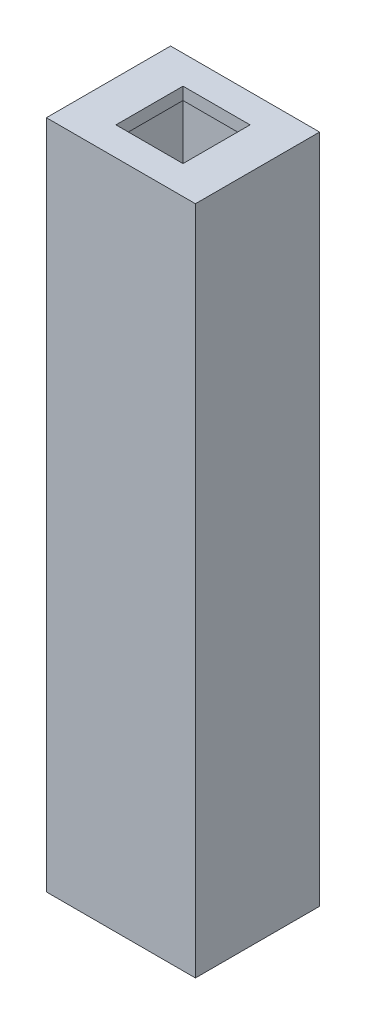
ISO-10303-21;
HEADER;
FILE_DESCRIPTION(('STEP AP214'),'2;1');
FILE_NAME('part.step','',(''),(''),'','','');
FILE_SCHEMA(('AUTOMOTIVE_DESIGN { 1 0 10303 214 1 1 1 1 }'));
ENDSEC;
DATA;
#1=APPLICATION_CONTEXT('core data for automotive mechanical design processes');
#2=APPLICATION_PROTOCOL_DEFINITION('international standard','automotive_design',2000,#1);
#3=PRODUCT_CONTEXT('',#1,'mechanical');
#4=PRODUCT('Part','Part','',(#3));
#5=PRODUCT_RELATED_PRODUCT_CATEGORY('part','',(#4));
#6=PRODUCT_DEFINITION_FORMATION('','',#4);
#7=PRODUCT_DEFINITION_CONTEXT('part definition',#1,'design');
#8=PRODUCT_DEFINITION('design','',#6,#7);
#9=PRODUCT_DEFINITION_SHAPE('','',#8);
#10=(LENGTH_UNIT() NAMED_UNIT(*) SI_UNIT(.MILLI.,.METRE.));
#11=(NAMED_UNIT(*) PLANE_ANGLE_UNIT() SI_UNIT($,.RADIAN.));
#12=(NAMED_UNIT(*) SI_UNIT($,.STERADIAN.) SOLID_ANGLE_UNIT());
#13=UNCERTAINTY_MEASURE_WITH_UNIT(LENGTH_MEASURE(1.E-05),#10,'distance_accuracy_value','');
#14=(GEOMETRIC_REPRESENTATION_CONTEXT(3) GLOBAL_UNCERTAINTY_ASSIGNED_CONTEXT((#13)) GLOBAL_UNIT_ASSIGNED_CONTEXT((#10,
#11,#12)) REPRESENTATION_CONTEXT('',''));
#15=CARTESIAN_POINT('',(0.,0.,0.));
#16=DIRECTION('',(0.,0.,1.));
#17=DIRECTION('',(1.,0.,0.));
#18=AXIS2_PLACEMENT_3D('',#15,#16,#17);
#19=CARTESIAN_POINT('',(0.,54.,-3.1));
#20=DIRECTION('',(0.,0.,-1.));
#21=DIRECTION('',(-1.,0.,0.));
#22=AXIS2_PLACEMENT_3D('',#19,#20,#21);
#23=PLANE('',#22);
#24=DIRECTION('',(1.,0.,0.));
#25=VECTOR('',#24,1.);
#26=CARTESIAN_POINT('',(0.,53.,-3.1));
#27=LINE('',#26,#25);
#28=CARTESIAN_POINT('',(-3.1,53.,-3.1));
#29=VERTEX_POINT('',#28);
#30=CARTESIAN_POINT('',(3.1,53.,-3.1));
#31=VERTEX_POINT('',#30);
#32=EDGE_CURVE('E208',#29,#31,#27,.T.);
#33=ORIENTED_EDGE('',*,*,#32,.F.);
#34=DIRECTION('',(0.,-1.,0.));
#35=VECTOR('',#34,1.);
#36=CARTESIAN_POINT('',(-3.1,54.,-3.1));
#37=LINE('',#36,#35);
#38=CARTESIAN_POINT('',(-3.1,0.,-3.1));
#39=VERTEX_POINT('',#38);
#40=EDGE_CURVE('E118',#29,#39,#37,.T.);
#41=ORIENTED_EDGE('',*,*,#40,.T.);
#42=DIRECTION('',(1.,0.,0.));
#43=VECTOR('',#42,1.);
#44=CARTESIAN_POINT('',(0.,0.,-3.1));
#45=LINE('',#44,#43);
#46=CARTESIAN_POINT('',(3.1,0.,-3.1));
#47=VERTEX_POINT('',#46);
#48=EDGE_CURVE('E232',#39,#47,#45,.T.);
#49=ORIENTED_EDGE('',*,*,#48,.T.);
#50=DIRECTION('',(0.,-1.,0.));
#51=VECTOR('',#50,1.);
#52=CARTESIAN_POINT('',(3.1,54.,-3.1));
#53=LINE('',#52,#51);
#54=EDGE_CURVE('E69',#31,#47,#53,.T.);
#55=ORIENTED_EDGE('',*,*,#54,.F.);
#56=EDGE_LOOP('',(#33,#41,#49,#55));
#57=FACE_BOUND('',#56,.T.);
#58=ADVANCED_FACE('F61',(#57),#23,.F.);
#59=CARTESIAN_POINT('',(3.1,54.,0.));
#60=DIRECTION('',(1.,0.,0.));
#61=DIRECTION('',(0.,0.,-1.));
#62=AXIS2_PLACEMENT_3D('',#59,#60,#61);
#63=PLANE('',#62);
#64=DIRECTION('',(0.,0.,1.));
#65=VECTOR('',#64,1.);
#66=CARTESIAN_POINT('',(3.1,53.,0.));
#67=LINE('',#66,#65);
#68=CARTESIAN_POINT('',(3.1,53.,3.1));
#69=VERTEX_POINT('',#68);
#70=EDGE_CURVE('E206',#31,#69,#67,.T.);
#71=ORIENTED_EDGE('',*,*,#70,.F.);
#72=ORIENTED_EDGE('',*,*,#54,.T.);
#73=DIRECTION('',(0.,0.,1.));
#74=VECTOR('',#73,1.);
#75=CARTESIAN_POINT('',(3.1,0.,0.));
#76=LINE('',#75,#74);
#77=CARTESIAN_POINT('',(3.1,0.,3.1));
#78=VERTEX_POINT('',#77);
#79=EDGE_CURVE('E234',#47,#78,#76,.T.);
#80=ORIENTED_EDGE('',*,*,#79,.T.);
#81=DIRECTION('',(0.,-1.,0.));
#82=VECTOR('',#81,1.);
#83=CARTESIAN_POINT('',(3.1,54.,3.1));
#84=LINE('',#83,#82);
#85=EDGE_CURVE('E245',#69,#78,#84,.T.);
#86=ORIENTED_EDGE('',*,*,#85,.F.);
#87=EDGE_LOOP('',(#71,#72,#80,#86));
#88=FACE_BOUND('',#87,.T.);
#89=ADVANCED_FACE('F287',(#88),#63,.F.);
#90=CARTESIAN_POINT('',(0.,54.,3.1));
#91=DIRECTION('',(0.,0.,-1.));
#92=DIRECTION('',(-1.,0.,0.));
#93=AXIS2_PLACEMENT_3D('',#90,#91,#92);
#94=PLANE('',#93);
#95=DIRECTION('',(0.,-1.,0.));
#96=VECTOR('',#95,1.);
#97=CARTESIAN_POINT('',(-3.1,54.,3.1));
#98=LINE('',#97,#96);
#99=CARTESIAN_POINT('',(-3.1,53.,3.1));
#100=VERTEX_POINT('',#99);
#101=CARTESIAN_POINT('',(-3.1,0.,3.1));
#102=VERTEX_POINT('',#101);
#103=EDGE_CURVE('E243',#100,#102,#98,.T.);
#104=ORIENTED_EDGE('',*,*,#103,.F.);
#105=DIRECTION('',(1.,0.,0.));
#106=VECTOR('',#105,1.);
#107=CARTESIAN_POINT('',(0.,53.,3.1));
#108=LINE('',#107,#106);
#109=EDGE_CURVE('E76',#100,#69,#108,.T.);
#110=ORIENTED_EDGE('',*,*,#109,.T.);
#111=ORIENTED_EDGE('',*,*,#85,.T.);
#112=DIRECTION('',(1.,0.,0.));
#113=VECTOR('',#112,1.);
#114=CARTESIAN_POINT('',(0.,0.,3.1));
#115=LINE('',#114,#113);
#116=EDGE_CURVE('E237',#102,#78,#115,.T.);
#117=ORIENTED_EDGE('',*,*,#116,.F.);
#118=EDGE_LOOP('',(#104,#110,#111,#117));
#119=FACE_BOUND('',#118,.T.);
#120=ADVANCED_FACE('F292',(#119),#94,.T.);
#121=CARTESIAN_POINT('',(-3.1,54.,0.));
#122=DIRECTION('',(1.,0.,0.));
#123=DIRECTION('',(0.,0.,-1.));
#124=AXIS2_PLACEMENT_3D('',#121,#122,#123);
#125=PLANE('',#124);
#126=ORIENTED_EDGE('',*,*,#40,.F.);
#127=DIRECTION('',(0.,0.,1.));
#128=VECTOR('',#127,1.);
#129=CARTESIAN_POINT('',(-3.1,53.,0.));
#130=LINE('',#129,#128);
#131=EDGE_CURVE('E12',#29,#100,#130,.T.);
#132=ORIENTED_EDGE('',*,*,#131,.T.);
#133=ORIENTED_EDGE('',*,*,#103,.T.);
#134=DIRECTION('',(0.,0.,1.));
#135=VECTOR('',#134,1.);
#136=CARTESIAN_POINT('',(-3.1,0.,0.));
#137=LINE('',#136,#135);
#138=EDGE_CURVE('E214',#39,#102,#137,.T.);
#139=ORIENTED_EDGE('',*,*,#138,.F.);
#140=EDGE_LOOP('',(#126,#132,#133,#139));
#141=FACE_BOUND('',#140,.T.);
#142=ADVANCED_FACE('F305',(#141),#125,.T.);
#143=CARTESIAN_POINT('',(6.,54.,0.));
#144=DIRECTION('',(1.,0.,0.));
#145=DIRECTION('',(0.,0.,-1.));
#146=AXIS2_PLACEMENT_3D('',#143,#144,#145);
#147=PLANE('',#146);
#148=DIRECTION('',(0.,-1.,0.));
#149=VECTOR('',#148,1.);
#150=CARTESIAN_POINT('',(6.,54.,5.));
#151=LINE('',#150,#149);
#152=CARTESIAN_POINT('',(6.,54.,5.));
#153=VERTEX_POINT('',#152);
#154=CARTESIAN_POINT('',(6.,0.,5.));
#155=VERTEX_POINT('',#154);
#156=EDGE_CURVE('E220',#153,#155,#151,.T.);
#157=ORIENTED_EDGE('',*,*,#156,.T.);
#158=DIRECTION('',(0.,0.,1.));
#159=VECTOR('',#158,1.);
#160=CARTESIAN_POINT('',(6.,0.,0.));
#161=LINE('',#160,#159);
#162=CARTESIAN_POINT('',(6.,0.,-5.));
#163=VERTEX_POINT('',#162);
#164=EDGE_CURVE('E210',#163,#155,#161,.T.);
#165=ORIENTED_EDGE('',*,*,#164,.F.);
#166=DIRECTION('',(0.,-1.,0.));
#167=VECTOR('',#166,1.);
#168=CARTESIAN_POINT('',(6.,54.,-5.));
#169=LINE('',#168,#167);
#170=CARTESIAN_POINT('',(6.,54.,-5.));
#171=VERTEX_POINT('',#170);
#172=EDGE_CURVE('E125',#171,#163,#169,.T.);
#173=ORIENTED_EDGE('',*,*,#172,.F.);
#174=DIRECTION('',(0.,0.,1.));
#175=VECTOR('',#174,1.);
#176=CARTESIAN_POINT('',(6.,54.,0.));
#177=LINE('',#176,#175);
#178=EDGE_CURVE('E211',#171,#153,#177,.T.);
#179=ORIENTED_EDGE('',*,*,#178,.T.);
#180=EDGE_LOOP('',(#157,#165,#173,#179));
#181=FACE_BOUND('',#180,.T.);
#182=ADVANCED_FACE('F63',(#181),#147,.T.);
#183=CARTESIAN_POINT('',(0.,54.,-5.));
#184=DIRECTION('',(0.,0.,-1.));
#185=DIRECTION('',(-1.,0.,0.));
#186=AXIS2_PLACEMENT_3D('',#183,#184,#185);
#187=PLANE('',#186);
#188=ORIENTED_EDGE('',*,*,#172,.T.);
#189=DIRECTION('',(1.,0.,0.));
#190=VECTOR('',#189,1.);
#191=CARTESIAN_POINT('',(0.,0.,-5.));
#192=LINE('',#191,#190);
#193=CARTESIAN_POINT('',(-6.,0.,-5.));
#194=VERTEX_POINT('',#193);
#195=EDGE_CURVE('E223',#194,#163,#192,.T.);
#196=ORIENTED_EDGE('',*,*,#195,.F.);
#197=DIRECTION('',(0.,-1.,0.));
#198=VECTOR('',#197,1.);
#199=CARTESIAN_POINT('',(-6.,54.,-5.));
#200=LINE('',#199,#198);
#201=CARTESIAN_POINT('',(-6.,54.,-5.));
#202=VERTEX_POINT('',#201);
#203=EDGE_CURVE('E251',#202,#194,#200,.T.);
#204=ORIENTED_EDGE('',*,*,#203,.F.);
#205=DIRECTION('',(1.,0.,0.));
#206=VECTOR('',#205,1.);
#207=CARTESIAN_POINT('',(0.,54.,-5.));
#208=LINE('',#207,#206);
#209=EDGE_CURVE('E213',#202,#171,#208,.T.);
#210=ORIENTED_EDGE('',*,*,#209,.T.);
#211=EDGE_LOOP('',(#188,#196,#204,#210));
#212=FACE_BOUND('',#211,.T.);
#213=ADVANCED_FACE('F254',(#212),#187,.T.);
#214=CARTESIAN_POINT('',(-6.,54.,0.));
#215=DIRECTION('',(1.,0.,0.));
#216=DIRECTION('',(0.,0.,-1.));
#217=AXIS2_PLACEMENT_3D('',#214,#215,#216);
#218=PLANE('',#217);
#219=ORIENTED_EDGE('',*,*,#203,.T.);
#220=DIRECTION('',(0.,0.,1.));
#221=VECTOR('',#220,1.);
#222=CARTESIAN_POINT('',(-6.,0.,0.));
#223=LINE('',#222,#221);
#224=CARTESIAN_POINT('',(-6.,0.,5.));
#225=VERTEX_POINT('',#224);
#226=EDGE_CURVE('E226',#194,#225,#223,.T.);
#227=ORIENTED_EDGE('',*,*,#226,.T.);
#228=DIRECTION('',(0.,-1.,0.));
#229=VECTOR('',#228,1.);
#230=CARTESIAN_POINT('',(-6.,54.,5.));
#231=LINE('',#230,#229);
#232=CARTESIAN_POINT('',(-6.,54.,5.));
#233=VERTEX_POINT('',#232);
#234=EDGE_CURVE('E249',#233,#225,#231,.T.);
#235=ORIENTED_EDGE('',*,*,#234,.F.);
#236=DIRECTION('',(0.,0.,1.));
#237=VECTOR('',#236,1.);
#238=CARTESIAN_POINT('',(-6.,54.,0.));
#239=LINE('',#238,#237);
#240=EDGE_CURVE('E217',#202,#233,#239,.T.);
#241=ORIENTED_EDGE('',*,*,#240,.F.);
#242=EDGE_LOOP('',(#219,#227,#235,#241));
#243=FACE_BOUND('',#242,.T.);
#244=ADVANCED_FACE('F263',(#243),#218,.F.);
#245=CARTESIAN_POINT('',(0.,54.,5.));
#246=DIRECTION('',(0.,0.,-1.));
#247=DIRECTION('',(-1.,0.,0.));
#248=AXIS2_PLACEMENT_3D('',#245,#246,#247);
#249=PLANE('',#248);
#250=ORIENTED_EDGE('',*,*,#234,.T.);
#251=DIRECTION('',(1.,0.,0.));
#252=VECTOR('',#251,1.);
#253=CARTESIAN_POINT('',(0.,0.,5.));
#254=LINE('',#253,#252);
#255=EDGE_CURVE('E229',#225,#155,#254,.T.);
#256=ORIENTED_EDGE('',*,*,#255,.T.);
#257=ORIENTED_EDGE('',*,*,#156,.F.);
#258=DIRECTION('',(1.,0.,0.));
#259=VECTOR('',#258,1.);
#260=CARTESIAN_POINT('',(0.,54.,5.));
#261=LINE('',#260,#259);
#262=EDGE_CURVE('E84',#233,#153,#261,.T.);
#263=ORIENTED_EDGE('',*,*,#262,.F.);
#264=EDGE_LOOP('',(#250,#256,#257,#263));
#265=FACE_BOUND('',#264,.T.);
#266=ADVANCED_FACE('F268',(#265),#249,.F.);
#267=CARTESIAN_POINT('',(0.,54.,0.));
#268=DIRECTION('',(0.,1.,0.));
#269=DIRECTION('',(0.,0.,1.));
#270=AXIS2_PLACEMENT_3D('',#267,#268,#269);
#271=PLANE('',#270);
#272=ORIENTED_EDGE('',*,*,#178,.F.);
#273=ORIENTED_EDGE('',*,*,#209,.F.);
#274=ORIENTED_EDGE('',*,*,#240,.T.);
#275=ORIENTED_EDGE('',*,*,#262,.T.);
#276=EDGE_LOOP('',(#272,#273,#274,#275));
#277=FACE_BOUND('',#276,.T.);
#278=DIRECTION('',(-1.,0.,0.));
#279=VECTOR('',#278,1.);
#280=CARTESIAN_POINT('',(0.,54.,-2.7));
#281=LINE('',#280,#279);
#282=CARTESIAN_POINT('',(2.7,54.,-2.7));
#283=VERTEX_POINT('',#282);
#284=CARTESIAN_POINT('',(-2.7,54.,-2.7));
#285=VERTEX_POINT('',#284);
#286=EDGE_CURVE('E167',#283,#285,#281,.T.);
#287=ORIENTED_EDGE('',*,*,#286,.F.);
#288=DIRECTION('',(0.,0.,1.));
#289=VECTOR('',#288,1.);
#290=CARTESIAN_POINT('',(2.7,54.,0.));
#291=LINE('',#290,#289);
#292=CARTESIAN_POINT('',(2.7,54.,2.7));
#293=VERTEX_POINT('',#292);
#294=EDGE_CURVE('E183',#283,#293,#291,.T.);
#295=ORIENTED_EDGE('',*,*,#294,.T.);
#296=DIRECTION('',(-1.,0.,0.));
#297=VECTOR('',#296,1.);
#298=CARTESIAN_POINT('',(0.,54.,2.7));
#299=LINE('',#298,#297);
#300=CARTESIAN_POINT('',(-2.7,54.,2.7));
#301=VERTEX_POINT('',#300);
#302=EDGE_CURVE('E186',#293,#301,#299,.T.);
#303=ORIENTED_EDGE('',*,*,#302,.T.);
#304=DIRECTION('',(0.,0.,1.));
#305=VECTOR('',#304,1.);
#306=CARTESIAN_POINT('',(-2.7,54.,0.));
#307=LINE('',#306,#305);
#308=EDGE_CURVE('E195',#285,#301,#307,.T.);
#309=ORIENTED_EDGE('',*,*,#308,.F.);
#310=EDGE_LOOP('',(#287,#295,#303,#309));
#311=FACE_BOUND('',#310,.T.);
#312=ADVANCED_FACE('F265',(#277,#311),#271,.T.);
#313=CARTESIAN_POINT('',(0.,0.,0.));
#314=DIRECTION('',(0.,1.,0.));
#315=DIRECTION('',(0.,0.,1.));
#316=AXIS2_PLACEMENT_3D('',#313,#314,#315);
#317=PLANE('',#316);
#318=CARTESIAN_POINT('',(4.5,0.,3.5));
#319=DIRECTION('',(0.,-1.,0.));
#320=DIRECTION('',(0.,0.,-1.));
#321=AXIS2_PLACEMENT_3D('',#318,#319,#320);
#322=CIRCLE('',#321,0.3);
#323=CARTESIAN_POINT('',(4.5,0.,3.2));
#324=VERTEX_POINT('',#323);
#325=EDGE_CURVE('E376',#324,#324,#322,.T.);
#326=ORIENTED_EDGE('',*,*,#325,.F.);
#327=EDGE_LOOP('',(#326));
#328=FACE_BOUND('',#327,.T.);
#329=CARTESIAN_POINT('',(-4.5,0.,-3.5));
#330=DIRECTION('',(0.,-1.,0.));
#331=DIRECTION('',(0.,0.,-1.));
#332=AXIS2_PLACEMENT_3D('',#329,#330,#331);
#333=CIRCLE('',#332,0.3);
#334=CARTESIAN_POINT('',(-4.5,0.,-3.8));
#335=VERTEX_POINT('',#334);
#336=EDGE_CURVE('E372',#335,#335,#333,.T.);
#337=ORIENTED_EDGE('',*,*,#336,.F.);
#338=EDGE_LOOP('',(#337));
#339=FACE_BOUND('',#338,.T.);
#340=CARTESIAN_POINT('',(4.5,0.,-3.5));
#341=DIRECTION('',(0.,-1.,0.));
#342=DIRECTION('',(0.,0.,-1.));
#343=AXIS2_PLACEMENT_3D('',#340,#341,#342);
#344=CIRCLE('',#343,0.3);
#345=CARTESIAN_POINT('',(4.5,0.,-3.8));
#346=VERTEX_POINT('',#345);
#347=EDGE_CURVE('E367',#346,#346,#344,.T.);
#348=ORIENTED_EDGE('',*,*,#347,.F.);
#349=EDGE_LOOP('',(#348));
#350=FACE_BOUND('',#349,.T.);
#351=CARTESIAN_POINT('',(-4.5,0.,3.5));
#352=DIRECTION('',(0.,-1.,0.));
#353=DIRECTION('',(0.,0.,-1.));
#354=AXIS2_PLACEMENT_3D('',#351,#352,#353);
#355=CIRCLE('',#354,0.3);
#356=CARTESIAN_POINT('',(-4.5,0.,3.2));
#357=VERTEX_POINT('',#356);
#358=EDGE_CURVE('E189',#357,#357,#355,.T.);
#359=ORIENTED_EDGE('',*,*,#358,.F.);
#360=EDGE_LOOP('',(#359));
#361=FACE_BOUND('',#360,.T.);
#362=ORIENTED_EDGE('',*,*,#164,.T.);
#363=ORIENTED_EDGE('',*,*,#255,.F.);
#364=ORIENTED_EDGE('',*,*,#226,.F.);
#365=ORIENTED_EDGE('',*,*,#195,.T.);
#366=EDGE_LOOP('',(#362,#363,#364,#365));
#367=FACE_BOUND('',#366,.T.);
#368=ORIENTED_EDGE('',*,*,#48,.F.);
#369=ORIENTED_EDGE('',*,*,#138,.T.);
#370=ORIENTED_EDGE('',*,*,#116,.T.);
#371=ORIENTED_EDGE('',*,*,#79,.F.);
#372=EDGE_LOOP('',(#368,#369,#370,#371));
#373=FACE_BOUND('',#372,.T.);
#374=ADVANCED_FACE('F259',(#328,#339,#350,#361,#367,#373),#317,.F.);
#375=CARTESIAN_POINT('',(0.,53.,0.));
#376=DIRECTION('',(0.,1.,0.));
#377=DIRECTION('',(0.,0.,1.));
#378=AXIS2_PLACEMENT_3D('',#375,#376,#377);
#379=PLANE('',#378);
#380=DIRECTION('',(0.,0.,1.));
#381=VECTOR('',#380,1.);
#382=CARTESIAN_POINT('',(2.7,53.,0.));
#383=LINE('',#382,#381);
#384=CARTESIAN_POINT('',(2.7,53.,-2.7));
#385=VERTEX_POINT('',#384);
#386=CARTESIAN_POINT('',(2.7,53.,2.7));
#387=VERTEX_POINT('',#386);
#388=EDGE_CURVE('E172',#385,#387,#383,.T.);
#389=ORIENTED_EDGE('',*,*,#388,.F.);
#390=DIRECTION('',(-1.,0.,0.));
#391=VECTOR('',#390,1.);
#392=CARTESIAN_POINT('',(0.,53.,-2.7));
#393=LINE('',#392,#391);
#394=CARTESIAN_POINT('',(-2.7,53.,-2.7));
#395=VERTEX_POINT('',#394);
#396=EDGE_CURVE('E164',#385,#395,#393,.T.);
#397=ORIENTED_EDGE('',*,*,#396,.T.);
#398=DIRECTION('',(0.,0.,1.));
#399=VECTOR('',#398,1.);
#400=CARTESIAN_POINT('',(-2.7,53.,0.));
#401=LINE('',#400,#399);
#402=CARTESIAN_POINT('',(-2.7,53.,2.7));
#403=VERTEX_POINT('',#402);
#404=EDGE_CURVE('E175',#395,#403,#401,.T.);
#405=ORIENTED_EDGE('',*,*,#404,.T.);
#406=DIRECTION('',(-1.,0.,0.));
#407=VECTOR('',#406,1.);
#408=CARTESIAN_POINT('',(0.,53.,2.7));
#409=LINE('',#408,#407);
#410=EDGE_CURVE('E180',#387,#403,#409,.T.);
#411=ORIENTED_EDGE('',*,*,#410,.F.);
#412=EDGE_LOOP('',(#389,#397,#405,#411));
#413=FACE_BOUND('',#412,.T.);
#414=ORIENTED_EDGE('',*,*,#131,.F.);
#415=ORIENTED_EDGE('',*,*,#32,.T.);
#416=ORIENTED_EDGE('',*,*,#70,.T.);
#417=ORIENTED_EDGE('',*,*,#109,.F.);
#418=EDGE_LOOP('',(#414,#415,#416,#417));
#419=FACE_BOUND('',#418,.T.);
#420=ADVANCED_FACE('F182',(#413,#419),#379,.F.);
#421=CARTESIAN_POINT('',(0.,53.,-2.7));
#422=DIRECTION('',(0.,0.,-1.));
#423=DIRECTION('',(-1.,0.,0.));
#424=AXIS2_PLACEMENT_3D('',#421,#422,#423);
#425=PLANE('',#424);
#426=ORIENTED_EDGE('',*,*,#286,.T.);
#427=DIRECTION('',(0.,1.,0.));
#428=VECTOR('',#427,1.);
#429=CARTESIAN_POINT('',(-2.7,53.,-2.7));
#430=LINE('',#429,#428);
#431=EDGE_CURVE('E160',#395,#285,#430,.T.);
#432=ORIENTED_EDGE('',*,*,#431,.F.);
#433=ORIENTED_EDGE('',*,*,#396,.F.);
#434=DIRECTION('',(0.,1.,0.));
#435=VECTOR('',#434,1.);
#436=CARTESIAN_POINT('',(2.7,53.,-2.7));
#437=LINE('',#436,#435);
#438=EDGE_CURVE('E200',#385,#283,#437,.T.);
#439=ORIENTED_EDGE('',*,*,#438,.T.);
#440=EDGE_LOOP('',(#426,#432,#433,#439));
#441=FACE_BOUND('',#440,.T.);
#442=ADVANCED_FACE('F162',(#441),#425,.F.);
#443=CARTESIAN_POINT('',(2.7,53.,0.));
#444=DIRECTION('',(-1.,0.,0.));
#445=DIRECTION('',(0.,0.,1.));
#446=AXIS2_PLACEMENT_3D('',#443,#444,#445);
#447=PLANE('',#446);
#448=ORIENTED_EDGE('',*,*,#294,.F.);
#449=ORIENTED_EDGE('',*,*,#438,.F.);
#450=ORIENTED_EDGE('',*,*,#388,.T.);
#451=DIRECTION('',(0.,1.,0.));
#452=VECTOR('',#451,1.);
#453=CARTESIAN_POINT('',(2.7,53.,2.7));
#454=LINE('',#453,#452);
#455=EDGE_CURVE('E202',#387,#293,#454,.T.);
#456=ORIENTED_EDGE('',*,*,#455,.T.);
#457=EDGE_LOOP('',(#448,#449,#450,#456));
#458=FACE_BOUND('',#457,.T.);
#459=ADVANCED_FACE('F276',(#458),#447,.T.);
#460=CARTESIAN_POINT('',(0.,53.,2.7));
#461=DIRECTION('',(0.,0.,-1.));
#462=DIRECTION('',(-1.,0.,0.));
#463=AXIS2_PLACEMENT_3D('',#460,#461,#462);
#464=PLANE('',#463);
#465=ORIENTED_EDGE('',*,*,#302,.F.);
#466=ORIENTED_EDGE('',*,*,#455,.F.);
#467=ORIENTED_EDGE('',*,*,#410,.T.);
#468=DIRECTION('',(0.,1.,0.));
#469=VECTOR('',#468,1.);
#470=CARTESIAN_POINT('',(-2.7,53.,2.7));
#471=LINE('',#470,#469);
#472=EDGE_CURVE('E171',#403,#301,#471,.T.);
#473=ORIENTED_EDGE('',*,*,#472,.T.);
#474=EDGE_LOOP('',(#465,#466,#467,#473));
#475=FACE_BOUND('',#474,.T.);
#476=ADVANCED_FACE('F274',(#475),#464,.T.);
#477=CARTESIAN_POINT('',(-2.7,53.,0.));
#478=DIRECTION('',(-1.,0.,0.));
#479=DIRECTION('',(0.,0.,1.));
#480=AXIS2_PLACEMENT_3D('',#477,#478,#479);
#481=PLANE('',#480);
#482=ORIENTED_EDGE('',*,*,#308,.T.);
#483=ORIENTED_EDGE('',*,*,#472,.F.);
#484=ORIENTED_EDGE('',*,*,#404,.F.);
#485=ORIENTED_EDGE('',*,*,#431,.T.);
#486=EDGE_LOOP('',(#482,#483,#484,#485));
#487=FACE_BOUND('',#486,.T.);
#488=ADVANCED_FACE('F176',(#487),#481,.F.);
#489=CARTESIAN_POINT('',(-4.5,2.,3.5));
#490=DIRECTION('',(0.,-1.,0.));
#491=DIRECTION('',(0.,0.,-1.));
#492=AXIS2_PLACEMENT_3D('',#489,#490,#491);
#493=CYLINDRICAL_SURFACE('',#492,0.3);
#494=CARTESIAN_POINT('',(-4.5,2.,3.5));
#495=DIRECTION('',(0.,-1.,0.));
#496=DIRECTION('',(0.,0.,-1.));
#497=AXIS2_PLACEMENT_3D('',#494,#495,#496);
#498=CIRCLE('',#497,0.3);
#499=CARTESIAN_POINT('',(-4.5,2.,3.2));
#500=VERTEX_POINT('',#499);
#501=EDGE_CURVE('E196',#500,#500,#498,.T.);
#502=ORIENTED_EDGE('',*,*,#501,.F.);
#503=EDGE_LOOP('',(#502));
#504=FACE_BOUND('',#503,.T.);
#505=ORIENTED_EDGE('',*,*,#358,.T.);
#506=EDGE_LOOP('',(#505));
#507=FACE_BOUND('',#506,.T.);
#508=ADVANCED_FACE('F322',(#504,#507),#493,.F.);
#509=CARTESIAN_POINT('',(-4.5,2.,3.5));
#510=DIRECTION('',(0.,-1.,0.));
#511=DIRECTION('',(0.,0.,-1.));
#512=AXIS2_PLACEMENT_3D('',#509,#510,#511);
#513=PLANE('',#512);
#514=ORIENTED_EDGE('',*,*,#501,.T.);
#515=EDGE_LOOP('',(#514));
#516=FACE_BOUND('',#515,.T.);
#517=ADVANCED_FACE('F326',(#516),#513,.T.);
#518=CARTESIAN_POINT('',(4.5,2.,-3.5));
#519=DIRECTION('',(0.,-1.,0.));
#520=DIRECTION('',(0.,0.,-1.));
#521=AXIS2_PLACEMENT_3D('',#518,#519,#520);
#522=CYLINDRICAL_SURFACE('',#521,0.3);
#523=CARTESIAN_POINT('',(4.5,2.,-3.5));
#524=DIRECTION('',(0.,-1.,0.));
#525=DIRECTION('',(0.,0.,-1.));
#526=AXIS2_PLACEMENT_3D('',#523,#524,#525);
#527=CIRCLE('',#526,0.3);
#528=CARTESIAN_POINT('',(4.5,2.,-3.8));
#529=VERTEX_POINT('',#528);
#530=EDGE_CURVE('E364',#529,#529,#527,.T.);
#531=ORIENTED_EDGE('',*,*,#530,.F.);
#532=EDGE_LOOP('',(#531));
#533=FACE_BOUND('',#532,.T.);
#534=ORIENTED_EDGE('',*,*,#347,.T.);
#535=EDGE_LOOP('',(#534));
#536=FACE_BOUND('',#535,.T.);
#537=ADVANCED_FACE('F331',(#533,#536),#522,.F.);
#538=CARTESIAN_POINT('',(4.5,2.,-3.5));
#539=DIRECTION('',(0.,-1.,0.));
#540=DIRECTION('',(0.,0.,-1.));
#541=AXIS2_PLACEMENT_3D('',#538,#539,#540);
#542=PLANE('',#541);
#543=ORIENTED_EDGE('',*,*,#530,.T.);
#544=EDGE_LOOP('',(#543));
#545=FACE_BOUND('',#544,.T.);
#546=ADVANCED_FACE('F345',(#545),#542,.T.);
#547=CARTESIAN_POINT('',(-4.5,2.,-3.5));
#548=DIRECTION('',(0.,-1.,0.));
#549=DIRECTION('',(0.,0.,-1.));
#550=AXIS2_PLACEMENT_3D('',#547,#548,#549);
#551=CYLINDRICAL_SURFACE('',#550,0.3);
#552=CARTESIAN_POINT('',(-4.5,2.,-3.5));
#553=DIRECTION('',(0.,-1.,0.));
#554=DIRECTION('',(0.,0.,-1.));
#555=AXIS2_PLACEMENT_3D('',#552,#553,#554);
#556=CIRCLE('',#555,0.3);
#557=CARTESIAN_POINT('',(-4.5,2.,-3.8));
#558=VERTEX_POINT('',#557);
#559=EDGE_CURVE('E369',#558,#558,#556,.T.);
#560=ORIENTED_EDGE('',*,*,#559,.F.);
#561=EDGE_LOOP('',(#560));
#562=FACE_BOUND('',#561,.T.);
#563=ORIENTED_EDGE('',*,*,#336,.T.);
#564=EDGE_LOOP('',(#563));
#565=FACE_BOUND('',#564,.T.);
#566=ADVANCED_FACE('F341',(#562,#565),#551,.F.);
#567=CARTESIAN_POINT('',(-4.5,2.,-3.5));
#568=DIRECTION('',(0.,-1.,0.));
#569=DIRECTION('',(0.,0.,-1.));
#570=AXIS2_PLACEMENT_3D('',#567,#568,#569);
#571=PLANE('',#570);
#572=ORIENTED_EDGE('',*,*,#559,.T.);
#573=EDGE_LOOP('',(#572));
#574=FACE_BOUND('',#573,.T.);
#575=ADVANCED_FACE('F337',(#574),#571,.T.);
#576=CARTESIAN_POINT('',(4.5,2.,3.5));
#577=DIRECTION('',(0.,-1.,0.));
#578=DIRECTION('',(0.,0.,-1.));
#579=AXIS2_PLACEMENT_3D('',#576,#577,#578);
#580=CYLINDRICAL_SURFACE('',#579,0.3);
#581=CARTESIAN_POINT('',(4.5,2.,3.5));
#582=DIRECTION('',(0.,-1.,0.));
#583=DIRECTION('',(0.,0.,-1.));
#584=AXIS2_PLACEMENT_3D('',#581,#582,#583);
#585=CIRCLE('',#584,0.3);
#586=CARTESIAN_POINT('',(4.5,2.,3.2));
#587=VERTEX_POINT('',#586);
#588=EDGE_CURVE('E379',#587,#587,#585,.T.);
#589=ORIENTED_EDGE('',*,*,#588,.F.);
#590=EDGE_LOOP('',(#589));
#591=FACE_BOUND('',#590,.T.);
#592=ORIENTED_EDGE('',*,*,#325,.T.);
#593=EDGE_LOOP('',(#592));
#594=FACE_BOUND('',#593,.T.);
#595=ADVANCED_FACE('F340',(#591,#594),#580,.F.);
#596=CARTESIAN_POINT('',(4.5,2.,3.5));
#597=DIRECTION('',(0.,-1.,0.));
#598=DIRECTION('',(0.,0.,-1.));
#599=AXIS2_PLACEMENT_3D('',#596,#597,#598);
#600=PLANE('',#599);
#601=ORIENTED_EDGE('',*,*,#588,.T.);
#602=EDGE_LOOP('',(#601));
#603=FACE_BOUND('',#602,.T.);
#604=ADVANCED_FACE('F347',(#603),#600,.T.);
#605=CLOSED_SHELL('',(#58,#89,#120,#142,#182,#213,#244,#266,#312,#374,#420,#442,#459,#476,#488,
#508,#517,#537,#546,#566,#575,#595,#604));
#606=MANIFOLD_SOLID_BREP('B2',#605);
#607=ADVANCED_BREP_SHAPE_REPRESENTATION('',(#18,#606),#14);
#608=SHAPE_DEFINITION_REPRESENTATION(#9,#607);
ENDSEC;
END-ISO-10303-21;
